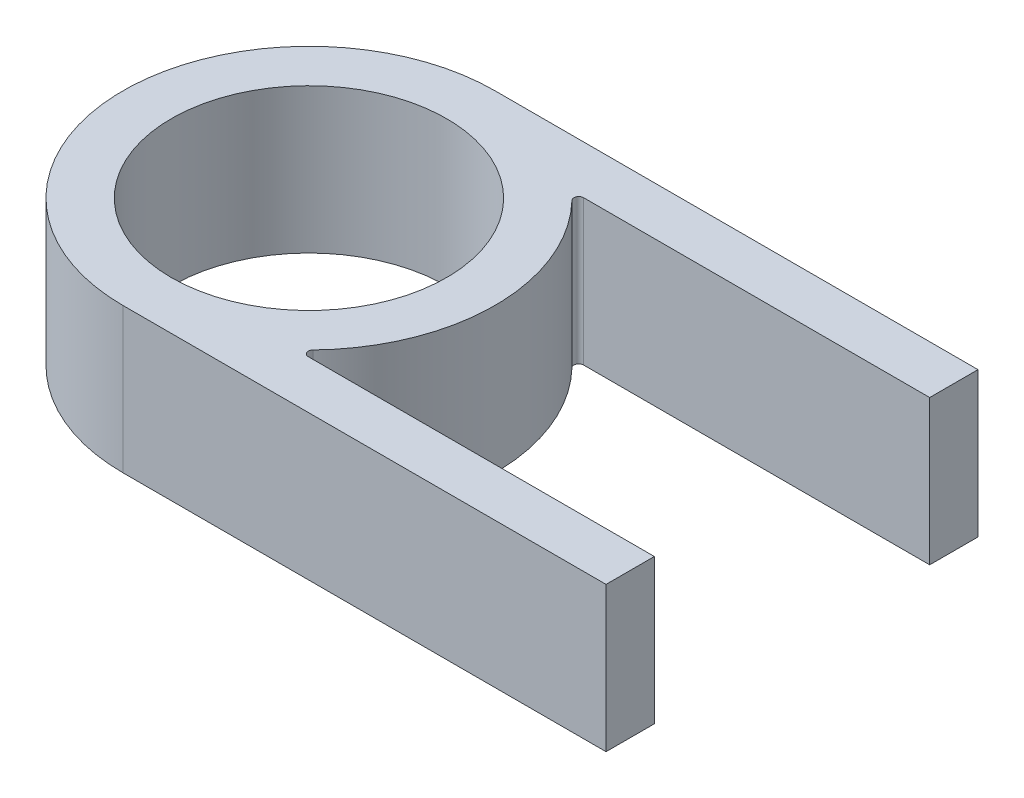
ISO-10303-21;
HEADER;
FILE_DESCRIPTION(('STEP AP214'),'2;1');
FILE_NAME('part.step','',(''),(''),'','','');
FILE_SCHEMA(('AUTOMOTIVE_DESIGN { 1 0 10303 214 1 1 1 1 }'));
ENDSEC;
DATA;
#1=APPLICATION_CONTEXT('core data for automotive mechanical design processes');
#2=APPLICATION_PROTOCOL_DEFINITION('international standard','automotive_design',2000,#1);
#3=PRODUCT_CONTEXT('',#1,'mechanical');
#4=PRODUCT('Part','Part','',(#3));
#5=PRODUCT_RELATED_PRODUCT_CATEGORY('part','',(#4));
#6=PRODUCT_DEFINITION_FORMATION('','',#4);
#7=PRODUCT_DEFINITION_CONTEXT('part definition',#1,'design');
#8=PRODUCT_DEFINITION('design','',#6,#7);
#9=PRODUCT_DEFINITION_SHAPE('','',#8);
#10=(LENGTH_UNIT() NAMED_UNIT(*) SI_UNIT(.MILLI.,.METRE.));
#11=(NAMED_UNIT(*) PLANE_ANGLE_UNIT() SI_UNIT($,.RADIAN.));
#12=(NAMED_UNIT(*) SI_UNIT($,.STERADIAN.) SOLID_ANGLE_UNIT());
#13=UNCERTAINTY_MEASURE_WITH_UNIT(LENGTH_MEASURE(1.E-05),#10,'distance_accuracy_value','');
#14=(GEOMETRIC_REPRESENTATION_CONTEXT(3) GLOBAL_UNCERTAINTY_ASSIGNED_CONTEXT((#13)) GLOBAL_UNIT_ASSIGNED_CONTEXT((#10,
#11,#12)) REPRESENTATION_CONTEXT('',''));
#15=CARTESIAN_POINT('',(0.,0.,0.));
#16=DIRECTION('',(0.,0.,1.));
#17=DIRECTION('',(1.,0.,0.));
#18=AXIS2_PLACEMENT_3D('',#15,#16,#17);
#19=CARTESIAN_POINT('',(28.3548937575157,30.,-27.5));
#20=DIRECTION('',(0.,1.,0.));
#21=DIRECTION('',(0.,0.,1.));
#22=AXIS2_PLACEMENT_3D('',#19,#20,#21);
#23=PLANE('',#22);
#24=CARTESIAN_POINT('',(28.3548937575157,30.,-27.5));
#25=DIRECTION('',(0.,-1.,0.));
#26=DIRECTION('',(0.,0.,1.));
#27=AXIS2_PLACEMENT_3D('',#24,#25,#26);
#28=CIRCLE('',#27,1.);
#29=CARTESIAN_POINT('',(27.637048345933,30.,-26.8037974683544));
#30=VERTEX_POINT('',#29);
#31=CARTESIAN_POINT('',(28.3548937575157,30.,-28.5));
#32=VERTEX_POINT('',#31);
#33=EDGE_CURVE('E163',#30,#32,#28,.T.);
#34=ORIENTED_EDGE('',*,*,#33,.T.);
#35=DIRECTION('',(1.,0.,0.));
#36=VECTOR('',#35,1.);
#37=CARTESIAN_POINT('',(28.3548937575157,30.,-28.5));
#38=LINE('',#37,#36);
#39=CARTESIAN_POINT('',(100.,30.,-28.5));
#40=VERTEX_POINT('',#39);
#41=EDGE_CURVE('E101',#32,#40,#38,.T.);
#42=ORIENTED_EDGE('',*,*,#41,.T.);
#43=DIRECTION('',(0.,0.,-1.));
#44=VECTOR('',#43,1.);
#45=CARTESIAN_POINT('',(100.,30.,-38.5));
#46=LINE('',#45,#44);
#47=CARTESIAN_POINT('',(100.,30.,-38.5));
#48=VERTEX_POINT('',#47);
#49=EDGE_CURVE('E184',#40,#48,#46,.T.);
#50=ORIENTED_EDGE('',*,*,#49,.T.);
#51=DIRECTION('',(-1.,0.,0.));
#52=VECTOR('',#51,1.);
#53=CARTESIAN_POINT('',(0.,30.,-38.5));
#54=LINE('',#53,#52);
#55=CARTESIAN_POINT('',(0.,30.,-38.5));
#56=VERTEX_POINT('',#55);
#57=EDGE_CURVE('E203',#48,#56,#54,.T.);
#58=ORIENTED_EDGE('',*,*,#57,.T.);
#59=CARTESIAN_POINT('',(0.,30.,0.));
#60=DIRECTION('',(0.,1.,0.));
#61=DIRECTION('',(0.,0.,1.));
#62=AXIS2_PLACEMENT_3D('',#59,#60,#61);
#63=CIRCLE('',#62,38.5);
#64=CARTESIAN_POINT('',(0.,30.,38.5));
#65=VERTEX_POINT('',#64);
#66=EDGE_CURVE('E200',#56,#65,#63,.T.);
#67=ORIENTED_EDGE('',*,*,#66,.T.);
#68=DIRECTION('',(1.,0.,0.));
#69=VECTOR('',#68,1.);
#70=CARTESIAN_POINT('',(0.,30.,38.5));
#71=LINE('',#70,#69);
#72=CARTESIAN_POINT('',(100.,30.,38.5));
#73=VERTEX_POINT('',#72);
#74=EDGE_CURVE('E202',#65,#73,#71,.T.);
#75=ORIENTED_EDGE('',*,*,#74,.T.);
#76=DIRECTION('',(0.,0.,-1.));
#77=VECTOR('',#76,1.);
#78=CARTESIAN_POINT('',(100.,30.,38.5));
#79=LINE('',#78,#77);
#80=CARTESIAN_POINT('',(100.,30.,28.5));
#81=VERTEX_POINT('',#80);
#82=EDGE_CURVE('E126',#73,#81,#79,.T.);
#83=ORIENTED_EDGE('',*,*,#82,.T.);
#84=DIRECTION('',(-1.,0.,0.));
#85=VECTOR('',#84,1.);
#86=CARTESIAN_POINT('',(28.3548937575157,30.,28.5));
#87=LINE('',#86,#85);
#88=CARTESIAN_POINT('',(28.3548937575157,30.,28.5));
#89=VERTEX_POINT('',#88);
#90=EDGE_CURVE('E120',#81,#89,#87,.T.);
#91=ORIENTED_EDGE('',*,*,#90,.T.);
#92=CARTESIAN_POINT('',(28.3548937575157,30.,27.5));
#93=DIRECTION('',(0.,-1.,0.));
#94=DIRECTION('',(0.,0.,1.));
#95=AXIS2_PLACEMENT_3D('',#92,#93,#94);
#96=CIRCLE('',#95,1.);
#97=CARTESIAN_POINT('',(27.637048345933,30.,26.8037974683544));
#98=VERTEX_POINT('',#97);
#99=EDGE_CURVE('E124',#89,#98,#96,.T.);
#100=ORIENTED_EDGE('',*,*,#99,.T.);
#101=CARTESIAN_POINT('',(0.,30.,0.));
#102=DIRECTION('',(0.,1.,0.));
#103=DIRECTION('',(0.,0.,1.));
#104=AXIS2_PLACEMENT_3D('',#101,#102,#103);
#105=CIRCLE('',#104,38.5);
#106=EDGE_CURVE('E52',#98,#30,#105,.T.);
#107=ORIENTED_EDGE('',*,*,#106,.T.);
#108=EDGE_LOOP('',(#34,#42,#50,#58,#67,#75,#83,#91,#100,#107));
#109=FACE_BOUND('',#108,.T.);
#110=CARTESIAN_POINT('',(0.,30.,0.));
#111=DIRECTION('',(0.,1.,0.));
#112=DIRECTION('',(0.,0.,1.));
#113=AXIS2_PLACEMENT_3D('',#110,#111,#112);
#114=CIRCLE('',#113,28.5);
#115=CARTESIAN_POINT('',(0.,30.,28.5));
#116=VERTEX_POINT('',#115);
#117=EDGE_CURVE('E148',#116,#116,#114,.T.);
#118=ORIENTED_EDGE('',*,*,#117,.F.);
#119=EDGE_LOOP('',(#118));
#120=FACE_BOUND('',#119,.T.);
#121=ADVANCED_FACE('F35',(#109,#120),#23,.T.);
#122=CARTESIAN_POINT('',(28.3548937575157,0.,-27.5));
#123=DIRECTION('',(0.,1.,0.));
#124=DIRECTION('',(0.,0.,1.));
#125=AXIS2_PLACEMENT_3D('',#122,#123,#124);
#126=PLANE('',#125);
#127=CARTESIAN_POINT('',(28.3548937575157,0.,-27.5));
#128=DIRECTION('',(0.,-1.,0.));
#129=DIRECTION('',(0.,0.,1.));
#130=AXIS2_PLACEMENT_3D('',#127,#128,#129);
#131=CIRCLE('',#130,1.);
#132=CARTESIAN_POINT('',(27.637048345933,0.,-26.8037974683544));
#133=VERTEX_POINT('',#132);
#134=CARTESIAN_POINT('',(28.3548937575157,0.,-28.5));
#135=VERTEX_POINT('',#134);
#136=EDGE_CURVE('E144',#133,#135,#131,.T.);
#137=ORIENTED_EDGE('',*,*,#136,.F.);
#138=CARTESIAN_POINT('',(0.,0.,0.));
#139=DIRECTION('',(0.,1.,0.));
#140=DIRECTION('',(0.,0.,1.));
#141=AXIS2_PLACEMENT_3D('',#138,#139,#140);
#142=CIRCLE('',#141,38.5);
#143=CARTESIAN_POINT('',(27.637048345933,0.,26.8037974683544));
#144=VERTEX_POINT('',#143);
#145=EDGE_CURVE('E93',#144,#133,#142,.T.);
#146=ORIENTED_EDGE('',*,*,#145,.F.);
#147=CARTESIAN_POINT('',(28.3548937575157,0.,27.5));
#148=DIRECTION('',(0.,-1.,0.));
#149=DIRECTION('',(0.,0.,1.));
#150=AXIS2_PLACEMENT_3D('',#147,#148,#149);
#151=CIRCLE('',#150,1.);
#152=CARTESIAN_POINT('',(28.3548937575157,0.,28.5));
#153=VERTEX_POINT('',#152);
#154=EDGE_CURVE('E87',#153,#144,#151,.T.);
#155=ORIENTED_EDGE('',*,*,#154,.F.);
#156=DIRECTION('',(-1.,0.,0.));
#157=VECTOR('',#156,1.);
#158=CARTESIAN_POINT('',(28.3548937575157,0.,28.5));
#159=LINE('',#158,#157);
#160=CARTESIAN_POINT('',(100.,0.,28.5));
#161=VERTEX_POINT('',#160);
#162=EDGE_CURVE('E134',#161,#153,#159,.T.);
#163=ORIENTED_EDGE('',*,*,#162,.F.);
#164=DIRECTION('',(0.,0.,-1.));
#165=VECTOR('',#164,1.);
#166=CARTESIAN_POINT('',(100.,0.,38.5));
#167=LINE('',#166,#165);
#168=CARTESIAN_POINT('',(100.,0.,38.5));
#169=VERTEX_POINT('',#168);
#170=EDGE_CURVE('E158',#169,#161,#167,.T.);
#171=ORIENTED_EDGE('',*,*,#170,.F.);
#172=DIRECTION('',(1.,0.,0.));
#173=VECTOR('',#172,1.);
#174=CARTESIAN_POINT('',(0.,0.,38.5));
#175=LINE('',#174,#173);
#176=CARTESIAN_POINT('',(0.,0.,38.5));
#177=VERTEX_POINT('',#176);
#178=EDGE_CURVE('E156',#177,#169,#175,.T.);
#179=ORIENTED_EDGE('',*,*,#178,.F.);
#180=CARTESIAN_POINT('',(0.,0.,0.));
#181=DIRECTION('',(0.,1.,0.));
#182=DIRECTION('',(0.,0.,1.));
#183=AXIS2_PLACEMENT_3D('',#180,#181,#182);
#184=CIRCLE('',#183,38.5);
#185=CARTESIAN_POINT('',(0.,0.,-38.5));
#186=VERTEX_POINT('',#185);
#187=EDGE_CURVE('E154',#186,#177,#184,.T.);
#188=ORIENTED_EDGE('',*,*,#187,.F.);
#189=DIRECTION('',(-1.,0.,0.));
#190=VECTOR('',#189,1.);
#191=CARTESIAN_POINT('',(0.,0.,-38.5));
#192=LINE('',#191,#190);
#193=CARTESIAN_POINT('',(100.,0.,-38.5));
#194=VERTEX_POINT('',#193);
#195=EDGE_CURVE('E152',#194,#186,#192,.T.);
#196=ORIENTED_EDGE('',*,*,#195,.F.);
#197=DIRECTION('',(0.,0.,-1.));
#198=VECTOR('',#197,1.);
#199=CARTESIAN_POINT('',(100.,0.,-38.5));
#200=LINE('',#199,#198);
#201=CARTESIAN_POINT('',(100.,0.,-28.5));
#202=VERTEX_POINT('',#201);
#203=EDGE_CURVE('E150',#202,#194,#200,.T.);
#204=ORIENTED_EDGE('',*,*,#203,.F.);
#205=DIRECTION('',(1.,0.,0.));
#206=VECTOR('',#205,1.);
#207=CARTESIAN_POINT('',(28.3548937575157,0.,-28.5));
#208=LINE('',#207,#206);
#209=EDGE_CURVE('E147',#135,#202,#208,.T.);
#210=ORIENTED_EDGE('',*,*,#209,.F.);
#211=EDGE_LOOP('',(#137,#146,#155,#163,#171,#179,#188,#196,#204,#210));
#212=FACE_BOUND('',#211,.T.);
#213=CARTESIAN_POINT('',(0.,0.,0.));
#214=DIRECTION('',(0.,1.,0.));
#215=DIRECTION('',(0.,0.,1.));
#216=AXIS2_PLACEMENT_3D('',#213,#214,#215);
#217=CIRCLE('',#216,28.5);
#218=CARTESIAN_POINT('',(0.,0.,28.5));
#219=VERTEX_POINT('',#218);
#220=EDGE_CURVE('E211',#219,#219,#217,.T.);
#221=ORIENTED_EDGE('',*,*,#220,.T.);
#222=EDGE_LOOP('',(#221));
#223=FACE_BOUND('',#222,.T.);
#224=ADVANCED_FACE('F188',(#212,#223),#126,.F.);
#225=CARTESIAN_POINT('',(28.3548937575157,30.,-27.5));
#226=DIRECTION('',(0.,-1.,0.));
#227=DIRECTION('',(0.,0.,-1.));
#228=AXIS2_PLACEMENT_3D('',#225,#226,#227);
#229=CYLINDRICAL_SURFACE('',#228,1.);
#230=ORIENTED_EDGE('',*,*,#136,.T.);
#231=DIRECTION('',(0.,-1.,0.));
#232=VECTOR('',#231,1.);
#233=CARTESIAN_POINT('',(28.3548937575157,30.,-28.5));
#234=LINE('',#233,#232);
#235=EDGE_CURVE('E11',#32,#135,#234,.T.);
#236=ORIENTED_EDGE('',*,*,#235,.F.);
#237=ORIENTED_EDGE('',*,*,#33,.F.);
#238=DIRECTION('',(0.,-1.,0.));
#239=VECTOR('',#238,1.);
#240=CARTESIAN_POINT('',(27.637048345933,30.,-26.8037974683544));
#241=LINE('',#240,#239);
#242=EDGE_CURVE('E140',#30,#133,#241,.T.);
#243=ORIENTED_EDGE('',*,*,#242,.T.);
#244=EDGE_LOOP('',(#230,#236,#237,#243));
#245=FACE_BOUND('',#244,.T.);
#246=ADVANCED_FACE('F37',(#245),#229,.F.);
#247=CARTESIAN_POINT('',(28.3548937575157,30.,-28.5));
#248=DIRECTION('',(0.,0.,-1.));
#249=DIRECTION('',(-1.,0.,0.));
#250=AXIS2_PLACEMENT_3D('',#247,#248,#249);
#251=PLANE('',#250);
#252=ORIENTED_EDGE('',*,*,#209,.T.);
#253=DIRECTION('',(0.,-1.,0.));
#254=VECTOR('',#253,1.);
#255=CARTESIAN_POINT('',(100.,30.,-28.5));
#256=LINE('',#255,#254);
#257=EDGE_CURVE('E44',#40,#202,#256,.T.);
#258=ORIENTED_EDGE('',*,*,#257,.F.);
#259=ORIENTED_EDGE('',*,*,#41,.F.);
#260=ORIENTED_EDGE('',*,*,#235,.T.);
#261=EDGE_LOOP('',(#252,#258,#259,#260));
#262=FACE_BOUND('',#261,.T.);
#263=ADVANCED_FACE('F247',(#262),#251,.F.);
#264=CARTESIAN_POINT('',(100.,30.,-38.5));
#265=DIRECTION('',(-1.,0.,0.));
#266=DIRECTION('',(0.,0.,1.));
#267=AXIS2_PLACEMENT_3D('',#264,#265,#266);
#268=PLANE('',#267);
#269=ORIENTED_EDGE('',*,*,#203,.T.);
#270=DIRECTION('',(0.,-1.,0.));
#271=VECTOR('',#270,1.);
#272=CARTESIAN_POINT('',(100.,30.,-38.5));
#273=LINE('',#272,#271);
#274=EDGE_CURVE('E176',#48,#194,#273,.T.);
#275=ORIENTED_EDGE('',*,*,#274,.F.);
#276=ORIENTED_EDGE('',*,*,#49,.F.);
#277=ORIENTED_EDGE('',*,*,#257,.T.);
#278=EDGE_LOOP('',(#269,#275,#276,#277));
#279=FACE_BOUND('',#278,.T.);
#280=ADVANCED_FACE('F182',(#279),#268,.F.);
#281=CARTESIAN_POINT('',(0.,30.,-38.5));
#282=DIRECTION('',(0.,0.,1.));
#283=DIRECTION('',(1.,0.,0.));
#284=AXIS2_PLACEMENT_3D('',#281,#282,#283);
#285=PLANE('',#284);
#286=ORIENTED_EDGE('',*,*,#195,.T.);
#287=DIRECTION('',(0.,-1.,0.));
#288=VECTOR('',#287,1.);
#289=CARTESIAN_POINT('',(0.,30.,-38.5));
#290=LINE('',#289,#288);
#291=EDGE_CURVE('E173',#56,#186,#290,.T.);
#292=ORIENTED_EDGE('',*,*,#291,.F.);
#293=ORIENTED_EDGE('',*,*,#57,.F.);
#294=ORIENTED_EDGE('',*,*,#274,.T.);
#295=EDGE_LOOP('',(#286,#292,#293,#294));
#296=FACE_BOUND('',#295,.T.);
#297=ADVANCED_FACE('F194',(#296),#285,.F.);
#298=CARTESIAN_POINT('',(0.,30.,0.));
#299=DIRECTION('',(0.,-1.,0.));
#300=DIRECTION('',(0.,0.,-1.));
#301=AXIS2_PLACEMENT_3D('',#298,#299,#300);
#302=CYLINDRICAL_SURFACE('',#301,38.5);
#303=ORIENTED_EDGE('',*,*,#187,.T.);
#304=DIRECTION('',(0.,-1.,0.));
#305=VECTOR('',#304,1.);
#306=CARTESIAN_POINT('',(0.,30.,38.5));
#307=LINE('',#306,#305);
#308=EDGE_CURVE('E170',#65,#177,#307,.T.);
#309=ORIENTED_EDGE('',*,*,#308,.F.);
#310=ORIENTED_EDGE('',*,*,#66,.F.);
#311=ORIENTED_EDGE('',*,*,#291,.T.);
#312=EDGE_LOOP('',(#303,#309,#310,#311));
#313=FACE_BOUND('',#312,.T.);
#314=ADVANCED_FACE('F198',(#313),#302,.T.);
#315=CARTESIAN_POINT('',(0.,30.,38.5));
#316=DIRECTION('',(0.,0.,-1.));
#317=DIRECTION('',(-1.,0.,0.));
#318=AXIS2_PLACEMENT_3D('',#315,#316,#317);
#319=PLANE('',#318);
#320=ORIENTED_EDGE('',*,*,#178,.T.);
#321=DIRECTION('',(0.,-1.,0.));
#322=VECTOR('',#321,1.);
#323=CARTESIAN_POINT('',(100.,30.,38.5));
#324=LINE('',#323,#322);
#325=EDGE_CURVE('E167',#73,#169,#324,.T.);
#326=ORIENTED_EDGE('',*,*,#325,.F.);
#327=ORIENTED_EDGE('',*,*,#74,.F.);
#328=ORIENTED_EDGE('',*,*,#308,.T.);
#329=EDGE_LOOP('',(#320,#326,#327,#328));
#330=FACE_BOUND('',#329,.T.);
#331=ADVANCED_FACE('F237',(#330),#319,.F.);
#332=CARTESIAN_POINT('',(100.,30.,38.5));
#333=DIRECTION('',(-1.,0.,0.));
#334=DIRECTION('',(0.,0.,1.));
#335=AXIS2_PLACEMENT_3D('',#332,#333,#334);
#336=PLANE('',#335);
#337=ORIENTED_EDGE('',*,*,#170,.T.);
#338=DIRECTION('',(0.,-1.,0.));
#339=VECTOR('',#338,1.);
#340=CARTESIAN_POINT('',(100.,30.,28.5));
#341=LINE('',#340,#339);
#342=EDGE_CURVE('E135',#81,#161,#341,.T.);
#343=ORIENTED_EDGE('',*,*,#342,.F.);
#344=ORIENTED_EDGE('',*,*,#82,.F.);
#345=ORIENTED_EDGE('',*,*,#325,.T.);
#346=EDGE_LOOP('',(#337,#343,#344,#345));
#347=FACE_BOUND('',#346,.T.);
#348=ADVANCED_FACE('F234',(#347),#336,.F.);
#349=CARTESIAN_POINT('',(28.3548937575157,30.,28.5));
#350=DIRECTION('',(0.,0.,1.));
#351=DIRECTION('',(1.,0.,0.));
#352=AXIS2_PLACEMENT_3D('',#349,#350,#351);
#353=PLANE('',#352);
#354=ORIENTED_EDGE('',*,*,#162,.T.);
#355=DIRECTION('',(0.,-1.,0.));
#356=VECTOR('',#355,1.);
#357=CARTESIAN_POINT('',(28.3548937575157,30.,28.5));
#358=LINE('',#357,#356);
#359=EDGE_CURVE('E131',#89,#153,#358,.T.);
#360=ORIENTED_EDGE('',*,*,#359,.F.);
#361=ORIENTED_EDGE('',*,*,#90,.F.);
#362=ORIENTED_EDGE('',*,*,#342,.T.);
#363=EDGE_LOOP('',(#354,#360,#361,#362));
#364=FACE_BOUND('',#363,.T.);
#365=ADVANCED_FACE('F132',(#364),#353,.F.);
#366=CARTESIAN_POINT('',(28.3548937575157,30.,27.5));
#367=DIRECTION('',(0.,-1.,0.));
#368=DIRECTION('',(0.,0.,-1.));
#369=AXIS2_PLACEMENT_3D('',#366,#367,#368);
#370=CYLINDRICAL_SURFACE('',#369,1.);
#371=ORIENTED_EDGE('',*,*,#154,.T.);
#372=DIRECTION('',(0.,-1.,0.));
#373=VECTOR('',#372,1.);
#374=CARTESIAN_POINT('',(27.637048345933,30.,26.8037974683544));
#375=LINE('',#374,#373);
#376=EDGE_CURVE('E136',#98,#144,#375,.T.);
#377=ORIENTED_EDGE('',*,*,#376,.F.);
#378=ORIENTED_EDGE('',*,*,#99,.F.);
#379=ORIENTED_EDGE('',*,*,#359,.T.);
#380=EDGE_LOOP('',(#371,#377,#378,#379));
#381=FACE_BOUND('',#380,.T.);
#382=ADVANCED_FACE('F138',(#381),#370,.F.);
#383=CARTESIAN_POINT('',(0.,30.,0.));
#384=DIRECTION('',(0.,-1.,0.));
#385=DIRECTION('',(0.,0.,-1.));
#386=AXIS2_PLACEMENT_3D('',#383,#384,#385);
#387=CYLINDRICAL_SURFACE('',#386,38.5);
#388=ORIENTED_EDGE('',*,*,#145,.T.);
#389=ORIENTED_EDGE('',*,*,#242,.F.);
#390=ORIENTED_EDGE('',*,*,#106,.F.);
#391=ORIENTED_EDGE('',*,*,#376,.T.);
#392=EDGE_LOOP('',(#388,#389,#390,#391));
#393=FACE_BOUND('',#392,.T.);
#394=ADVANCED_FACE('F227',(#393),#387,.T.);
#395=CARTESIAN_POINT('',(0.,30.,0.));
#396=DIRECTION('',(0.,-1.,0.));
#397=DIRECTION('',(0.,0.,-1.));
#398=AXIS2_PLACEMENT_3D('',#395,#396,#397);
#399=CYLINDRICAL_SURFACE('',#398,28.5);
#400=ORIENTED_EDGE('',*,*,#117,.T.);
#401=EDGE_LOOP('',(#400));
#402=FACE_BOUND('',#401,.T.);
#403=ORIENTED_EDGE('',*,*,#220,.F.);
#404=EDGE_LOOP('',(#403));
#405=FACE_BOUND('',#404,.T.);
#406=ADVANCED_FACE('F217',(#402,#405),#399,.F.);
#407=CLOSED_SHELL('',(#121,#224,#246,#263,#280,#297,#314,#331,#348,#365,#382,#394,#406));
#408=MANIFOLD_SOLID_BREP('B2',#407);
#409=ADVANCED_BREP_SHAPE_REPRESENTATION('',(#18,#408),#14);
#410=SHAPE_DEFINITION_REPRESENTATION(#9,#409);
ENDSEC;
END-ISO-10303-21;
